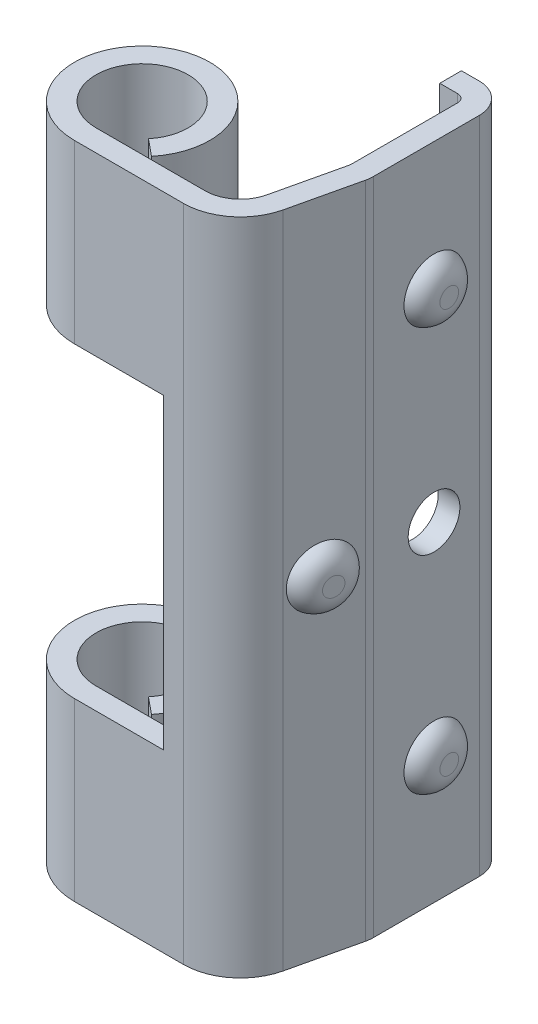
ISO-10303-21;
HEADER;
FILE_DESCRIPTION(('STEP AP214'),'2;1');
FILE_NAME('part.step','',(''),(''),'','','');
FILE_SCHEMA(('AUTOMOTIVE_DESIGN { 1 0 10303 214 1 1 1 1 }'));
ENDSEC;
DATA;
#1=APPLICATION_CONTEXT('core data for automotive mechanical design processes');
#2=APPLICATION_PROTOCOL_DEFINITION('international standard','automotive_design',2000,#1);
#3=PRODUCT_CONTEXT('',#1,'mechanical');
#4=PRODUCT('Part','Part','',(#3));
#5=PRODUCT_RELATED_PRODUCT_CATEGORY('part','',(#4));
#6=PRODUCT_DEFINITION_FORMATION('','',#4);
#7=PRODUCT_DEFINITION_CONTEXT('part definition',#1,'design');
#8=PRODUCT_DEFINITION('design','',#6,#7);
#9=PRODUCT_DEFINITION_SHAPE('','',#8);
#10=(LENGTH_UNIT() NAMED_UNIT(*) SI_UNIT(.MILLI.,.METRE.));
#11=(NAMED_UNIT(*) PLANE_ANGLE_UNIT() SI_UNIT($,.RADIAN.));
#12=(NAMED_UNIT(*) SI_UNIT($,.STERADIAN.) SOLID_ANGLE_UNIT());
#13=UNCERTAINTY_MEASURE_WITH_UNIT(LENGTH_MEASURE(1.E-05),#10,'distance_accuracy_value','');
#14=(GEOMETRIC_REPRESENTATION_CONTEXT(3) GLOBAL_UNCERTAINTY_ASSIGNED_CONTEXT((#13)) GLOBAL_UNIT_ASSIGNED_CONTEXT((#10,
#11,#12)) REPRESENTATION_CONTEXT('',''));
#15=CARTESIAN_POINT('',(0.,0.,0.));
#16=DIRECTION('',(0.,0.,1.));
#17=DIRECTION('',(1.,0.,0.));
#18=AXIS2_PLACEMENT_3D('',#15,#16,#17);
#19=CARTESIAN_POINT('',(0.251124105055345,21.9964,12.0938583782292));
#20=DIRECTION('',(-0.974370064785235,0.,-0.224951054343866));
#21=DIRECTION('',(-0.224951054343866,0.,0.974370064785235));
#22=AXIS2_PLACEMENT_3D('',#19,#20,#21);
#23=PLANE('',#22);
#24=CARTESIAN_POINT('',(0.251124105055326,21.9964,12.0938583782292));
#25=DIRECTION('',(0.974370064785235,0.,0.224951054343868));
#26=DIRECTION('',(0.224951054343868,0.,-0.974370064785235));
#27=AXIS2_PLACEMENT_3D('',#24,#25,#26);
#28=CIRCLE('',#27,0.624690596312461);
#29=CARTESIAN_POINT('',(0.391648913334514,21.9964,11.4851785614295));
#30=VERTEX_POINT('',#29);
#31=EDGE_CURVE('E20',#30,#30,#28,.F.);
#32=ORIENTED_EDGE('',*,*,#31,.F.);
#33=EDGE_LOOP('',(#32));
#34=FACE_BOUND('',#33,.T.);
#35=ADVANCED_FACE('F16',(#34),#23,.F.);
#36=CARTESIAN_POINT('',(0.870243287068091,35.4912331125158,5.0038));
#37=DIRECTION('',(-1.,0.,0.));
#38=DIRECTION('',(0.,0.,1.));
#39=AXIS2_PLACEMENT_3D('',#36,#37,#38);
#40=PLANE('',#39);
#41=CARTESIAN_POINT('',(0.870243287068091,35.4912331125158,5.0038));
#42=DIRECTION('',(1.,0.,0.));
#43=DIRECTION('',(0.,0.,-1.));
#44=AXIS2_PLACEMENT_3D('',#41,#42,#43);
#45=CIRCLE('',#44,0.624690596312479);
#46=CARTESIAN_POINT('',(0.870243287068091,35.4912331125158,4.37910940368752));
#47=VERTEX_POINT('',#46);
#48=EDGE_CURVE('E514',#47,#47,#45,.F.);
#49=ORIENTED_EDGE('',*,*,#48,.F.);
#50=EDGE_LOOP('',(#49));
#51=FACE_BOUND('',#50,.T.);
#52=ADVANCED_FACE('F524',(#51),#40,.F.);
#53=CARTESIAN_POINT('',(0.870243287068091,8.5015668874842,5.0038));
#54=DIRECTION('',(-1.,0.,0.));
#55=DIRECTION('',(0.,0.,1.));
#56=AXIS2_PLACEMENT_3D('',#53,#54,#55);
#57=PLANE('',#56);
#58=CARTESIAN_POINT('',(0.870243287068091,8.5015668874842,5.0038));
#59=DIRECTION('',(1.,0.,0.));
#60=DIRECTION('',(0.,0.,-1.));
#61=AXIS2_PLACEMENT_3D('',#58,#59,#60);
#62=CIRCLE('',#61,0.624690596312479);
#63=CARTESIAN_POINT('',(0.870243287068091,8.5015668874842,4.37910940368752));
#64=VERTEX_POINT('',#63);
#65=EDGE_CURVE('E171',#64,#64,#62,.F.);
#66=ORIENTED_EDGE('',*,*,#65,.F.);
#67=EDGE_LOOP('',(#66));
#68=FACE_BOUND('',#67,.T.);
#69=ADVANCED_FACE('F530',(#68),#57,.F.);
#70=CARTESIAN_POINT('',(-3.32075671293206,0.,0.));
#71=DIRECTION('',(1.,0.,0.));
#72=DIRECTION('',(0.,0.,-1.));
#73=AXIS2_PLACEMENT_3D('',#70,#71,#72);
#74=PLANE('',#73);
#75=DIRECTION('',(0.,1.,0.));
#76=VECTOR('',#75,1.);
#77=CARTESIAN_POINT('',(-3.32075671293206,0.,1.4478));
#78=LINE('',#77,#76);
#79=CARTESIAN_POINT('',(-3.32075671293206,43.9928,1.4478));
#80=VERTEX_POINT('',#79);
#81=CARTESIAN_POINT('',(-3.32075671293206,0.,1.4478));
#82=VERTEX_POINT('',#81);
#83=EDGE_CURVE('E439',#80,#82,#78,.F.);
#84=ORIENTED_EDGE('',*,*,#83,.F.);
#85=DIRECTION('',(0.,0.,-1.));
#86=VECTOR('',#85,1.);
#87=CARTESIAN_POINT('',(-3.32075671293206,43.9928,0.));
#88=LINE('',#87,#86);
#89=CARTESIAN_POINT('',(-3.32075671293206,43.9928,0.));
#90=VERTEX_POINT('',#89);
#91=EDGE_CURVE('E448',#90,#80,#88,.F.);
#92=ORIENTED_EDGE('',*,*,#91,.F.);
#93=DIRECTION('',(0.,1.,0.));
#94=VECTOR('',#93,1.);
#95=CARTESIAN_POINT('',(-3.32075671293206,0.,0.));
#96=LINE('',#95,#94);
#97=CARTESIAN_POINT('',(-3.32075671293206,0.,0.));
#98=VERTEX_POINT('',#97);
#99=EDGE_CURVE('E170',#90,#98,#96,.F.);
#100=ORIENTED_EDGE('',*,*,#99,.T.);
#101=DIRECTION('',(0.,0.,-1.));
#102=VECTOR('',#101,1.);
#103=CARTESIAN_POINT('',(-3.32075671293206,0.,0.));
#104=LINE('',#103,#102);
#105=EDGE_CURVE('E445',#82,#98,#104,.T.);
#106=ORIENTED_EDGE('',*,*,#105,.F.);
#107=EDGE_LOOP('',(#84,#92,#100,#106));
#108=FACE_BOUND('',#107,.T.);
#109=ADVANCED_FACE('F638',(#108),#74,.F.);
#110=CARTESIAN_POINT('',(-0.577556712931909,35.4912331125158,5.0038));
#111=DIRECTION('',(-1.,0.,0.));
#112=DIRECTION('',(0.,0.,1.));
#113=AXIS2_PLACEMENT_3D('',#110,#111,#112);
#114=PLANE('',#113);
#115=CARTESIAN_POINT('',(-0.577556712931908,35.4912331125158,5.0038));
#116=DIRECTION('',(-1.,0.,0.));
#117=DIRECTION('',(0.,0.,1.));
#118=AXIS2_PLACEMENT_3D('',#115,#116,#117);
#119=CIRCLE('',#118,0.558799999999999);
#120=CARTESIAN_POINT('',(-0.577556712931908,35.4912331125158,5.5626));
#121=VERTEX_POINT('',#120);
#122=EDGE_CURVE('E412',#121,#121,#119,.F.);
#123=ORIENTED_EDGE('',*,*,#122,.F.);
#124=EDGE_LOOP('',(#123));
#125=FACE_BOUND('',#124,.T.);
#126=ADVANCED_FACE('F779',(#125),#114,.T.);
#127=CARTESIAN_POINT('',(-0.577556712931909,8.5015668874842,5.0038));
#128=DIRECTION('',(-1.,0.,0.));
#129=DIRECTION('',(0.,0.,1.));
#130=AXIS2_PLACEMENT_3D('',#127,#128,#129);
#131=PLANE('',#130);
#132=CARTESIAN_POINT('',(-0.577556712931908,8.5015668874842,5.0038));
#133=DIRECTION('',(-1.,0.,0.));
#134=DIRECTION('',(0.,0.,1.));
#135=AXIS2_PLACEMENT_3D('',#132,#133,#134);
#136=CIRCLE('',#135,0.558799999999999);
#137=CARTESIAN_POINT('',(-0.577556712931908,8.5015668874842,5.5626));
#138=VERTEX_POINT('',#137);
#139=EDGE_CURVE('E433',#138,#138,#136,.F.);
#140=ORIENTED_EDGE('',*,*,#139,.F.);
#141=EDGE_LOOP('',(#140));
#142=FACE_BOUND('',#141,.T.);
#143=ADVANCED_FACE('F770',(#142),#131,.T.);
#144=CARTESIAN_POINT('',(-3.32075671293206,0.,1.4478));
#145=DIRECTION('',(0.,0.,1.));
#146=DIRECTION('',(1.,0.,0.));
#147=AXIS2_PLACEMENT_3D('',#144,#145,#146);
#148=PLANE('',#147);
#149=DIRECTION('',(1.,0.,0.));
#150=VECTOR('',#149,1.);
#151=CARTESIAN_POINT('',(-3.32075671293206,0.,1.4478));
#152=LINE('',#151,#150);
#153=CARTESIAN_POINT('',(-2.12695671293191,0.,1.4478));
#154=VERTEX_POINT('',#153);
#155=EDGE_CURVE('E428',#82,#154,#152,.T.);
#156=ORIENTED_EDGE('',*,*,#155,.T.);
#157=DIRECTION('',(0.,-1.,0.));
#158=VECTOR('',#157,1.);
#159=CARTESIAN_POINT('',(-2.12695671293191,0.,1.4478));
#160=LINE('',#159,#158);
#161=CARTESIAN_POINT('',(-2.12695671293191,43.9928,1.4478));
#162=VERTEX_POINT('',#161);
#163=EDGE_CURVE('E429',#154,#162,#160,.F.);
#164=ORIENTED_EDGE('',*,*,#163,.T.);
#165=DIRECTION('',(1.,0.,0.));
#166=VECTOR('',#165,1.);
#167=CARTESIAN_POINT('',(-3.32075671293206,43.9928,1.4478));
#168=LINE('',#167,#166);
#169=EDGE_CURVE('E442',#162,#80,#168,.F.);
#170=ORIENTED_EDGE('',*,*,#169,.T.);
#171=ORIENTED_EDGE('',*,*,#83,.T.);
#172=EDGE_LOOP('',(#156,#164,#170,#171));
#173=FACE_BOUND('',#172,.T.);
#174=ADVANCED_FACE('F631',(#173),#148,.T.);
#175=CARTESIAN_POINT('',(-1.15956887474072,21.9964,11.7681742417502));
#176=DIRECTION('',(-0.974370064785235,0.,-0.224951054343866));
#177=DIRECTION('',(-0.224951054343866,0.,0.974370064785235));
#178=AXIS2_PLACEMENT_3D('',#175,#176,#177);
#179=PLANE('',#178);
#180=CARTESIAN_POINT('',(-1.1595688747407,21.9964,11.7681742417501));
#181=DIRECTION('',(-0.974370064785235,0.,-0.224951054343866));
#182=DIRECTION('',(-0.224951054343866,0.,0.974370064785235));
#183=AXIS2_PLACEMENT_3D('',#180,#181,#182);
#184=CIRCLE('',#183,0.558799999999994);
#185=CARTESIAN_POINT('',(-1.28527152390805,21.9964,12.3126522339521));
#186=VERTEX_POINT('',#185);
#187=EDGE_CURVE('E505',#186,#186,#184,.F.);
#188=ORIENTED_EDGE('',*,*,#187,.F.);
#189=EDGE_LOOP('',(#188));
#190=FACE_BOUND('',#189,.T.);
#191=ADVANCED_FACE('F670',(#190),#179,.T.);
#192=CARTESIAN_POINT('',(-8.71744862460074,21.9964,15.2908));
#193=DIRECTION('',(0.634831460674158,0.,-0.772650643265322));
#194=DIRECTION('',(-0.772650643265322,0.,-0.634831460674158));
#195=AXIS2_PLACEMENT_3D('',#192,#193,#194);
#196=PLANE('',#195);
#197=DIRECTION('',(0.,-1.,0.));
#198=VECTOR('',#197,1.);
#199=CARTESIAN_POINT('',(-9.83609222592024,0.,14.3716910112359));
#200=LINE('',#199,#198);
#201=CARTESIAN_POINT('',(-9.83609222592025,11.7348,14.3716910112359));
#202=VERTEX_POINT('',#201);
#203=CARTESIAN_POINT('',(-9.83609222592024,0.,14.3716910112359));
#204=VERTEX_POINT('',#203);
#205=EDGE_CURVE('E329',#202,#204,#200,.T.);
#206=ORIENTED_EDGE('',*,*,#205,.T.);
#207=DIRECTION('',(-0.772650643265302,0.,-0.634831460674182));
#208=VECTOR('',#207,1.);
#209=CARTESIAN_POINT('',(-8.71744862460074,0.,15.2908));
#210=LINE('',#209,#208);
#211=CARTESIAN_POINT('',(-8.71744862460073,0.,15.2908));
#212=VERTEX_POINT('',#211);
#213=EDGE_CURVE('E322',#212,#204,#210,.T.);
#214=ORIENTED_EDGE('',*,*,#213,.F.);
#215=DIRECTION('',(0.,-1.,0.));
#216=VECTOR('',#215,1.);
#217=CARTESIAN_POINT('',(-8.71744862460073,0.,15.2908));
#218=LINE('',#217,#216);
#219=CARTESIAN_POINT('',(-8.71744862460073,11.7348,15.2908));
#220=VERTEX_POINT('',#219);
#221=EDGE_CURVE('E419',#220,#212,#218,.T.);
#222=ORIENTED_EDGE('',*,*,#221,.F.);
#223=DIRECTION('',(-0.772650643265322,0.,-0.634831460674158));
#224=VECTOR('',#223,1.);
#225=CARTESIAN_POINT('',(-8.71744862460074,11.7348,15.2908));
#226=LINE('',#225,#224);
#227=EDGE_CURVE('E426',#202,#220,#226,.F.);
#228=ORIENTED_EDGE('',*,*,#227,.F.);
#229=EDGE_LOOP('',(#206,#214,#222,#228));
#230=FACE_BOUND('',#229,.T.);
#231=ADVANCED_FACE('F606',(#230),#196,.F.);
#232=CARTESIAN_POINT('',(-1.15956887474075,21.9964,11.7681742417501));
#233=DIRECTION('',(0.974370064785235,0.,0.224951054343868));
#234=DIRECTION('',(0.224951054343868,0.,-0.974370064785235));
#235=AXIS2_PLACEMENT_3D('',#232,#233,#234);
#236=DEGENERATE_TOROIDAL_SURFACE('',#235,0.624690596312477,1.44780000000002,.T.);
#237=CARTESIAN_POINT('',(-0.73883588076645,21.9964,11.8653081070158));
#238=DIRECTION('',(0.974370064785235,0.,0.224951054343868));
#239=DIRECTION('',(0.224951054343868,0.,-0.974370064785235));
#240=AXIS2_PLACEMENT_3D('',#237,#238,#239);
#241=CIRCLE('',#240,2.0066);
#242=CARTESIAN_POINT('',(-0.287449095120044,21.9964,9.91013713501778));
#243=VERTEX_POINT('',#242);
#244=EDGE_CURVE('E182',#243,#243,#241,.T.);
#245=ORIENTED_EDGE('',*,*,#244,.T.);
#246=EDGE_LOOP('',(#245));
#247=FACE_BOUND('',#246,.T.);
#248=ORIENTED_EDGE('',*,*,#31,.T.);
#249=EDGE_LOOP('',(#248));
#250=FACE_BOUND('',#249,.T.);
#251=ADVANCED_FACE('F521',(#247,#250),#236,.T.);
#252=CARTESIAN_POINT('',(-0.577556712931908,35.4912331125158,5.0038));
#253=DIRECTION('',(1.,0.,0.));
#254=DIRECTION('',(0.,0.,-1.));
#255=AXIS2_PLACEMENT_3D('',#252,#253,#254);
#256=DEGENERATE_TOROIDAL_SURFACE('',#255,0.624690596312479,1.4478,.T.);
#257=CARTESIAN_POINT('',(-0.145756712931909,35.4912331125158,5.0038));
#258=DIRECTION('',(1.,0.,0.));
#259=DIRECTION('',(0.,0.,-1.));
#260=AXIS2_PLACEMENT_3D('',#257,#258,#259);
#261=CIRCLE('',#260,2.0066);
#262=CARTESIAN_POINT('',(-0.145756712931909,35.4912331125158,2.9972));
#263=VERTEX_POINT('',#262);
#264=EDGE_CURVE('E294',#263,#263,#261,.T.);
#265=ORIENTED_EDGE('',*,*,#264,.T.);
#266=EDGE_LOOP('',(#265));
#267=FACE_BOUND('',#266,.T.);
#268=ORIENTED_EDGE('',*,*,#48,.T.);
#269=EDGE_LOOP('',(#268));
#270=FACE_BOUND('',#269,.T.);
#271=ADVANCED_FACE('F659',(#267,#270),#256,.T.);
#272=CARTESIAN_POINT('',(-0.577556712931908,8.5015668874842,5.0038));
#273=DIRECTION('',(1.,0.,0.));
#274=DIRECTION('',(0.,0.,-1.));
#275=AXIS2_PLACEMENT_3D('',#272,#273,#274);
#276=DEGENERATE_TOROIDAL_SURFACE('',#275,0.624690596312479,1.4478,.T.);
#277=CARTESIAN_POINT('',(-0.145756712931909,8.5015668874842,5.0038));
#278=DIRECTION('',(1.,0.,0.));
#279=DIRECTION('',(0.,0.,-1.));
#280=AXIS2_PLACEMENT_3D('',#277,#278,#279);
#281=CIRCLE('',#280,2.0066);
#282=CARTESIAN_POINT('',(-0.145756712931909,8.5015668874842,2.9972));
#283=VERTEX_POINT('',#282);
#284=EDGE_CURVE('E482',#283,#283,#281,.T.);
#285=ORIENTED_EDGE('',*,*,#284,.T.);
#286=EDGE_LOOP('',(#285));
#287=FACE_BOUND('',#286,.T.);
#288=ORIENTED_EDGE('',*,*,#65,.T.);
#289=EDGE_LOOP('',(#288));
#290=FACE_BOUND('',#289,.T.);
#291=ADVANCED_FACE('F18',(#287,#290),#276,.T.);
#292=CARTESIAN_POINT('',(-2.33015671293191,0.,9.04751905722588));
#293=DIRECTION('',(0.,-1.,0.));
#294=DIRECTION('',(0.,0.,-1.));
#295=AXIS2_PLACEMENT_3D('',#292,#293,#294);
#296=CYLINDRICAL_SURFACE('',#295,2.1844);
#297=CARTESIAN_POINT('',(-2.33015671293191,0.,9.04751905722588));
#298=DIRECTION('',(0.,-1.,0.));
#299=DIRECTION('',(0.,0.,-1.));
#300=AXIS2_PLACEMENT_3D('',#297,#298,#299);
#301=CIRCLE('',#300,2.1844);
#302=CARTESIAN_POINT('',(-0.145756712931909,0.,9.04751905722588));
#303=VERTEX_POINT('',#302);
#304=CARTESIAN_POINT('',(-0.201742743415041,0.,9.53890214033462));
#305=VERTEX_POINT('',#304);
#306=EDGE_CURVE('E326',#303,#305,#301,.T.);
#307=ORIENTED_EDGE('',*,*,#306,.F.);
#308=DIRECTION('',(0.,1.,0.));
#309=VECTOR('',#308,1.);
#310=CARTESIAN_POINT('',(-0.145756712931909,0.,9.04751905722588));
#311=LINE('',#310,#309);
#312=CARTESIAN_POINT('',(-0.145756712931909,43.9928,9.04751905722588));
#313=VERTEX_POINT('',#312);
#314=EDGE_CURVE('E168',#303,#313,#311,.T.);
#315=ORIENTED_EDGE('',*,*,#314,.T.);
#316=CARTESIAN_POINT('',(-2.33015671293191,43.9928,9.04751905722588));
#317=DIRECTION('',(0.,-1.,0.));
#318=DIRECTION('',(0.,0.,-1.));
#319=AXIS2_PLACEMENT_3D('',#316,#317,#318);
#320=CIRCLE('',#319,2.1844);
#321=CARTESIAN_POINT('',(-0.201742743415042,43.9928,9.53890214033462));
#322=VERTEX_POINT('',#321);
#323=EDGE_CURVE('E160',#313,#322,#320,.T.);
#324=ORIENTED_EDGE('',*,*,#323,.T.);
#325=DIRECTION('',(0.,1.,0.));
#326=VECTOR('',#325,1.);
#327=CARTESIAN_POINT('',(-0.201742743415041,0.,9.53890214033462));
#328=LINE('',#327,#326);
#329=EDGE_CURVE('E165',#322,#305,#328,.F.);
#330=ORIENTED_EDGE('',*,*,#329,.T.);
#331=EDGE_LOOP('',(#307,#315,#324,#330));
#332=FACE_BOUND('',#331,.T.);
#333=ADVANCED_FACE('F164',(#332),#296,.T.);
#334=CARTESIAN_POINT('',(-3.32075671293206,0.,0.));
#335=DIRECTION('',(0.,0.,1.));
#336=DIRECTION('',(1.,0.,0.));
#337=AXIS2_PLACEMENT_3D('',#334,#335,#336);
#338=PLANE('',#337);
#339=DIRECTION('',(0.,-1.,0.));
#340=VECTOR('',#339,1.);
#341=CARTESIAN_POINT('',(-2.12695671293191,0.,0.));
#342=LINE('',#341,#340);
#343=CARTESIAN_POINT('',(-2.12695671293191,0.,0.));
#344=VERTEX_POINT('',#343);
#345=CARTESIAN_POINT('',(-2.12695671293191,43.9928,0.));
#346=VERTEX_POINT('',#345);
#347=EDGE_CURVE('E283',#344,#346,#342,.F.);
#348=ORIENTED_EDGE('',*,*,#347,.F.);
#349=DIRECTION('',(1.,0.,0.));
#350=VECTOR('',#349,1.);
#351=CARTESIAN_POINT('',(-3.32075671293206,0.,0.));
#352=LINE('',#351,#350);
#353=EDGE_CURVE('E327',#98,#344,#352,.T.);
#354=ORIENTED_EDGE('',*,*,#353,.F.);
#355=ORIENTED_EDGE('',*,*,#99,.F.);
#356=DIRECTION('',(1.,0.,0.));
#357=VECTOR('',#356,1.);
#358=CARTESIAN_POINT('',(-3.32075671293206,43.9928,0.));
#359=LINE('',#358,#357);
#360=EDGE_CURVE('E404',#346,#90,#359,.F.);
#361=ORIENTED_EDGE('',*,*,#360,.F.);
#362=EDGE_LOOP('',(#348,#354,#355,#361));
#363=FACE_BOUND('',#362,.T.);
#364=ADVANCED_FACE('F646',(#363),#338,.F.);
#365=CARTESIAN_POINT('',(-0.145756712931909,35.4912331125158,5.0038));
#366=DIRECTION('',(-1.,0.,0.));
#367=DIRECTION('',(0.,0.,1.));
#368=AXIS2_PLACEMENT_3D('',#365,#366,#367);
#369=TOROIDAL_SURFACE('',#368,1.94070940368752,1.4478);
#370=ORIENTED_EDGE('',*,*,#122,.T.);
#371=EDGE_LOOP('',(#370));
#372=FACE_BOUND('',#371,.T.);
#373=CARTESIAN_POINT('',(-1.59355671293191,35.4912331125158,5.0038));
#374=DIRECTION('',(-1.,0.,0.));
#375=DIRECTION('',(0.,0.,1.));
#376=AXIS2_PLACEMENT_3D('',#373,#374,#375);
#377=CIRCLE('',#376,1.94070940368752);
#378=CARTESIAN_POINT('',(-1.59355671293191,35.4912331125158,6.94450940368752));
#379=VERTEX_POINT('',#378);
#380=EDGE_CURVE('E286',#379,#379,#377,.F.);
#381=ORIENTED_EDGE('',*,*,#380,.F.);
#382=EDGE_LOOP('',(#381));
#383=FACE_BOUND('',#382,.T.);
#384=ADVANCED_FACE('F383',(#372,#383),#369,.T.);
#385=CARTESIAN_POINT('',(-0.145756712931909,8.5015668874842,5.0038));
#386=DIRECTION('',(-1.,0.,0.));
#387=DIRECTION('',(0.,0.,1.));
#388=AXIS2_PLACEMENT_3D('',#385,#386,#387);
#389=TOROIDAL_SURFACE('',#388,1.94070940368752,1.4478);
#390=ORIENTED_EDGE('',*,*,#139,.T.);
#391=EDGE_LOOP('',(#390));
#392=FACE_BOUND('',#391,.T.);
#393=CARTESIAN_POINT('',(-1.59355671293191,8.5015668874842,5.0038));
#394=DIRECTION('',(-1.,0.,0.));
#395=DIRECTION('',(0.,0.,1.));
#396=AXIS2_PLACEMENT_3D('',#393,#394,#395);
#397=CIRCLE('',#396,1.94070940368752);
#398=CARTESIAN_POINT('',(-1.59355671293191,8.5015668874842,6.94450940368752));
#399=VERTEX_POINT('',#398);
#400=EDGE_CURVE('E477',#399,#399,#397,.F.);
#401=ORIENTED_EDGE('',*,*,#400,.F.);
#402=EDGE_LOOP('',(#401));
#403=FACE_BOUND('',#402,.T.);
#404=ADVANCED_FACE('F378',(#392,#403),#389,.T.);
#405=CARTESIAN_POINT('',(-50.1207419075645,21.9964,5.0038));
#406=DIRECTION('',(-1.,0.,0.));
#407=DIRECTION('',(0.,0.,1.));
#408=AXIS2_PLACEMENT_3D('',#405,#406,#407);
#409=CYLINDRICAL_SURFACE('',#408,1.7272);
#410=CARTESIAN_POINT('',(-1.59355671293191,21.9964,5.0038));
#411=DIRECTION('',(-1.,0.,0.));
#412=DIRECTION('',(0.,0.,1.));
#413=AXIS2_PLACEMENT_3D('',#410,#411,#412);
#414=CIRCLE('',#413,1.7272);
#415=CARTESIAN_POINT('',(-1.59355671293191,21.9964,6.731));
#416=VERTEX_POINT('',#415);
#417=EDGE_CURVE('E279',#416,#416,#414,.F.);
#418=ORIENTED_EDGE('',*,*,#417,.F.);
#419=EDGE_LOOP('',(#418));
#420=FACE_BOUND('',#419,.T.);
#421=CARTESIAN_POINT('',(-0.145756712931912,21.9964,5.0038));
#422=DIRECTION('',(-1.,0.,0.));
#423=DIRECTION('',(0.,0.,1.));
#424=AXIS2_PLACEMENT_3D('',#421,#422,#423);
#425=CIRCLE('',#424,1.7272);
#426=CARTESIAN_POINT('',(-0.145756712931912,21.9964,6.731));
#427=VERTEX_POINT('',#426);
#428=EDGE_CURVE('E417',#427,#427,#425,.F.);
#429=ORIENTED_EDGE('',*,*,#428,.T.);
#430=EDGE_LOOP('',(#429));
#431=FACE_BOUND('',#430,.T.);
#432=ADVANCED_FACE('F382',(#420,#431),#409,.F.);
#433=CARTESIAN_POINT('',(-2.12695671293191,0.,1.9812));
#434=DIRECTION('',(0.,-1.,0.));
#435=DIRECTION('',(0.,0.,-1.));
#436=AXIS2_PLACEMENT_3D('',#433,#434,#435);
#437=CYLINDRICAL_SURFACE('',#436,0.5334);
#438=ORIENTED_EDGE('',*,*,#163,.F.);
#439=CARTESIAN_POINT('',(-2.12695671293191,0.,1.9812));
#440=DIRECTION('',(0.,-1.,0.));
#441=DIRECTION('',(0.,0.,-1.));
#442=AXIS2_PLACEMENT_3D('',#439,#440,#441);
#443=CIRCLE('',#442,0.5334);
#444=CARTESIAN_POINT('',(-1.59355671293191,0.,1.9812));
#445=VERTEX_POINT('',#444);
#446=EDGE_CURVE('E423',#445,#154,#443,.F.);
#447=ORIENTED_EDGE('',*,*,#446,.F.);
#448=DIRECTION('',(0.,1.,0.));
#449=VECTOR('',#448,1.);
#450=CARTESIAN_POINT('',(-1.59355671293191,0.,1.9812));
#451=LINE('',#450,#449);
#452=CARTESIAN_POINT('',(-1.59355671293191,43.9928,1.9812));
#453=VERTEX_POINT('',#452);
#454=EDGE_CURVE('E270',#453,#445,#451,.F.);
#455=ORIENTED_EDGE('',*,*,#454,.F.);
#456=CARTESIAN_POINT('',(-2.12695671293191,43.9928,1.9812));
#457=DIRECTION('',(0.,-1.,0.));
#458=DIRECTION('',(0.,0.,-1.));
#459=AXIS2_PLACEMENT_3D('',#456,#457,#458);
#460=CIRCLE('',#459,0.5334);
#461=EDGE_CURVE('E432',#162,#453,#460,.T.);
#462=ORIENTED_EDGE('',*,*,#461,.F.);
#463=EDGE_LOOP('',(#438,#447,#455,#462));
#464=FACE_BOUND('',#463,.T.);
#465=ADVANCED_FACE('F359',(#464),#437,.F.);
#466=CARTESIAN_POINT('',(-0.738835880766454,21.9964,11.8653081070158));
#467=DIRECTION('',(-0.974370064785235,0.,-0.224951054343866));
#468=DIRECTION('',(-0.224951054343866,0.,0.974370064785235));
#469=AXIS2_PLACEMENT_3D('',#466,#467,#468);
#470=TOROIDAL_SURFACE('',#469,1.94070940368752,1.4478);
#471=ORIENTED_EDGE('',*,*,#187,.T.);
#472=EDGE_LOOP('',(#471));
#473=FACE_BOUND('',#472,.T.);
#474=CARTESIAN_POINT('',(-2.14952886056252,21.9964,11.5396239705368));
#475=DIRECTION('',(-0.974370064785235,0.,-0.224951054343866));
#476=DIRECTION('',(-0.224951054343866,0.,0.974370064785235));
#477=AXIS2_PLACEMENT_3D('',#474,#475,#476);
#478=CIRCLE('',#477,1.94070940368755);
#479=CARTESIAN_POINT('',(-2.58609348709709,21.9964,13.4305931179371));
#480=VERTEX_POINT('',#479);
#481=EDGE_CURVE('E233',#480,#480,#478,.F.);
#482=ORIENTED_EDGE('',*,*,#481,.F.);
#483=EDGE_LOOP('',(#482));
#484=FACE_BOUND('',#483,.T.);
#485=ADVANCED_FACE('F353',(#473,#484),#470,.T.);
#486=CARTESIAN_POINT('',(-2.33015671293191,0.,9.04751905722588));
#487=DIRECTION('',(0.,-1.,0.));
#488=DIRECTION('',(0.,0.,-1.));
#489=AXIS2_PLACEMENT_3D('',#486,#487,#488);
#490=CYLINDRICAL_SURFACE('',#489,0.7366);
#491=DIRECTION('',(0.,1.,0.));
#492=VECTOR('',#491,1.);
#493=CARTESIAN_POINT('',(-1.59355671293191,0.,9.04751905722588));
#494=LINE('',#493,#492);
#495=CARTESIAN_POINT('',(-1.59355671293191,0.,9.04751905722588));
#496=VERTEX_POINT('',#495);
#497=CARTESIAN_POINT('',(-1.59355671293191,43.9928,9.04751905722588));
#498=VERTEX_POINT('',#497);
#499=EDGE_CURVE('E280',#496,#498,#494,.T.);
#500=ORIENTED_EDGE('',*,*,#499,.F.);
#501=CARTESIAN_POINT('',(-2.33015671293191,0.,9.04751905722588));
#502=DIRECTION('',(0.,-1.,0.));
#503=DIRECTION('',(0.,0.,-1.));
#504=AXIS2_PLACEMENT_3D('',#501,#502,#503);
#505=CIRCLE('',#504,0.7366);
#506=CARTESIAN_POINT('',(-1.61243572321111,0.,9.21321800385557));
#507=VERTEX_POINT('',#506);
#508=EDGE_CURVE('E500',#507,#496,#505,.F.);
#509=ORIENTED_EDGE('',*,*,#508,.F.);
#510=DIRECTION('',(0.,1.,0.));
#511=VECTOR('',#510,1.);
#512=CARTESIAN_POINT('',(-1.61243572321111,0.,9.21321800385558));
#513=LINE('',#512,#511);
#514=CARTESIAN_POINT('',(-1.61243572321111,43.9928,9.21321800385557));
#515=VERTEX_POINT('',#514);
#516=EDGE_CURVE('E238',#515,#507,#513,.F.);
#517=ORIENTED_EDGE('',*,*,#516,.F.);
#518=CARTESIAN_POINT('',(-2.33015671293191,43.9928,9.04751905722588));
#519=DIRECTION('',(0.,-1.,0.));
#520=DIRECTION('',(0.,0.,-1.));
#521=AXIS2_PLACEMENT_3D('',#518,#519,#520);
#522=CIRCLE('',#521,0.7366);
#523=EDGE_CURVE('E425',#498,#515,#522,.T.);
#524=ORIENTED_EDGE('',*,*,#523,.F.);
#525=EDGE_LOOP('',(#500,#509,#517,#524));
#526=FACE_BOUND('',#525,.T.);
#527=ADVANCED_FACE('F358',(#526),#490,.F.);
#528=CARTESIAN_POINT('',(-12.2107567129319,0.,12.4206));
#529=DIRECTION('',(0.,-1.,0.));
#530=DIRECTION('',(0.,0.,-1.));
#531=AXIS2_PLACEMENT_3D('',#528,#529,#530);
#532=CYLINDRICAL_SURFACE('',#531,3.0734);
#533=DIRECTION('',(0.,1.,0.));
#534=VECTOR('',#533,1.);
#535=CARTESIAN_POINT('',(-12.2107567129319,0.,15.494));
#536=LINE('',#535,#534);
#537=CARTESIAN_POINT('',(-12.2107567129319,0.,15.494));
#538=VERTEX_POINT('',#537);
#539=CARTESIAN_POINT('',(-12.2107567129319,11.7348,15.494));
#540=VERTEX_POINT('',#539);
#541=EDGE_CURVE('E339',#538,#540,#536,.T.);
#542=ORIENTED_EDGE('',*,*,#541,.F.);
#543=CARTESIAN_POINT('',(-12.2107567129319,0.,12.4206));
#544=DIRECTION('',(0.,-1.,0.));
#545=DIRECTION('',(0.,0.,-1.));
#546=AXIS2_PLACEMENT_3D('',#543,#544,#545);
#547=CIRCLE('',#546,3.0734);
#548=EDGE_CURVE('E325',#204,#538,#547,.F.);
#549=ORIENTED_EDGE('',*,*,#548,.F.);
#550=ORIENTED_EDGE('',*,*,#205,.F.);
#551=CARTESIAN_POINT('',(-12.2107567129319,11.7348,12.4206));
#552=DIRECTION('',(0.,-1.,0.));
#553=DIRECTION('',(0.,0.,-1.));
#554=AXIS2_PLACEMENT_3D('',#551,#552,#553);
#555=CIRCLE('',#554,3.0734);
#556=EDGE_CURVE('E493',#540,#202,#555,.T.);
#557=ORIENTED_EDGE('',*,*,#556,.F.);
#558=EDGE_LOOP('',(#542,#549,#550,#557));
#559=FACE_BOUND('',#558,.T.);
#560=ADVANCED_FACE('F604',(#559),#532,.F.);
#561=CARTESIAN_POINT('',(-3.32075671293206,0.,0.));
#562=DIRECTION('',(0.,-1.,0.));
#563=DIRECTION('',(0.,0.,-1.));
#564=AXIS2_PLACEMENT_3D('',#561,#562,#563);
#565=PLANE('',#564);
#566=ORIENTED_EDGE('',*,*,#155,.F.);
#567=ORIENTED_EDGE('',*,*,#105,.T.);
#568=ORIENTED_EDGE('',*,*,#353,.T.);
#569=CARTESIAN_POINT('',(-2.12695671293191,0.,1.9812));
#570=DIRECTION('',(0.,-1.,0.));
#571=DIRECTION('',(0.,0.,-1.));
#572=AXIS2_PLACEMENT_3D('',#569,#570,#571);
#573=CIRCLE('',#572,1.9812);
#574=CARTESIAN_POINT('',(-0.145756712931909,0.,1.9812));
#575=VERTEX_POINT('',#574);
#576=EDGE_CURVE('E287',#575,#344,#573,.F.);
#577=ORIENTED_EDGE('',*,*,#576,.F.);
#578=DIRECTION('',(0.,0.,1.));
#579=VECTOR('',#578,1.);
#580=CARTESIAN_POINT('',(-0.145756712931909,0.,1.9812));
#581=LINE('',#580,#579);
#582=EDGE_CURVE('E292',#575,#303,#581,.T.);
#583=ORIENTED_EDGE('',*,*,#582,.T.);
#584=ORIENTED_EDGE('',*,*,#306,.T.);
#585=DIRECTION('',(-0.224951054343866,0.,0.974370064785235));
#586=VECTOR('',#585,1.);
#587=CARTESIAN_POINT('',(-0.145756712931909,0.,9.2964));
#588=LINE('',#587,#586);
#589=CARTESIAN_POINT('',(-1.22909727703597,0.,13.9888635170501));
#590=VERTEX_POINT('',#589);
#591=EDGE_CURVE('E181',#305,#590,#588,.T.);
#592=ORIENTED_EDGE('',*,*,#591,.T.);
#593=CARTESIAN_POINT('',(-4.94144722386772,0.,13.1318));
#594=DIRECTION('',(0.,-1.,0.));
#595=DIRECTION('',(0.,0.,-1.));
#596=AXIS2_PLACEMENT_3D('',#593,#594,#595);
#597=CIRCLE('',#596,3.81);
#598=CARTESIAN_POINT('',(-4.94144722386772,0.,16.9418));
#599=VERTEX_POINT('',#598);
#600=EDGE_CURVE('E311',#599,#590,#597,.F.);
#601=ORIENTED_EDGE('',*,*,#600,.F.);
#602=DIRECTION('',(-1.,0.,0.));
#603=VECTOR('',#602,1.);
#604=CARTESIAN_POINT('',(-4.94144722386772,0.,16.9418));
#605=LINE('',#604,#603);
#606=CARTESIAN_POINT('',(-12.2107567129319,0.,16.9418));
#607=VERTEX_POINT('',#606);
#608=EDGE_CURVE('E298',#599,#607,#605,.T.);
#609=ORIENTED_EDGE('',*,*,#608,.T.);
#610=CARTESIAN_POINT('',(-12.2107567129319,0.,12.4206));
#611=DIRECTION('',(0.,-1.,0.));
#612=DIRECTION('',(0.,0.,-1.));
#613=AXIS2_PLACEMENT_3D('',#610,#611,#612);
#614=CIRCLE('',#613,4.5212);
#615=EDGE_CURVE('E422',#212,#607,#614,.F.);
#616=ORIENTED_EDGE('',*,*,#615,.F.);
#617=ORIENTED_EDGE('',*,*,#213,.T.);
#618=ORIENTED_EDGE('',*,*,#548,.T.);
#619=DIRECTION('',(-1.,0.,0.));
#620=VECTOR('',#619,1.);
#621=CARTESIAN_POINT('',(-4.94144722386772,0.,15.494));
#622=LINE('',#621,#620);
#623=CARTESIAN_POINT('',(-4.94144722386772,0.,15.494));
#624=VERTEX_POINT('',#623);
#625=EDGE_CURVE('E225',#624,#538,#622,.T.);
#626=ORIENTED_EDGE('',*,*,#625,.F.);
#627=CARTESIAN_POINT('',(-4.94144722386772,0.,13.1318));
#628=DIRECTION('',(0.,-1.,0.));
#629=DIRECTION('',(0.,0.,-1.));
#630=AXIS2_PLACEMENT_3D('',#627,#628,#629);
#631=CIRCLE('',#630,2.3622);
#632=CARTESIAN_POINT('',(-2.63979025683204,0.,13.6631793805711));
#633=VERTEX_POINT('',#632);
#634=EDGE_CURVE('E228',#624,#633,#631,.F.);
#635=ORIENTED_EDGE('',*,*,#634,.T.);
#636=DIRECTION('',(-0.224951054343866,0.,0.974370064785235));
#637=VECTOR('',#636,1.);
#638=CARTESIAN_POINT('',(-1.55644969272798,0.,8.97071586352095));
#639=LINE('',#638,#637);
#640=EDGE_CURVE('E346',#507,#633,#639,.T.);
#641=ORIENTED_EDGE('',*,*,#640,.F.);
#642=ORIENTED_EDGE('',*,*,#508,.T.);
#643=DIRECTION('',(0.,0.,1.));
#644=VECTOR('',#643,1.);
#645=CARTESIAN_POINT('',(-1.59355671293191,0.,1.9812));
#646=LINE('',#645,#644);
#647=EDGE_CURVE('E278',#445,#496,#646,.T.);
#648=ORIENTED_EDGE('',*,*,#647,.F.);
#649=ORIENTED_EDGE('',*,*,#446,.T.);
#650=EDGE_LOOP('',(#566,#567,#568,#577,#583,#584,#592,#601,#609,#616,#617,#618,#626,#635,#641,
#642,#648,#649));
#651=FACE_BOUND('',#650,.T.);
#652=ADVANCED_FACE('F599',(#651),#565,.T.);
#653=CARTESIAN_POINT('',(-12.2107567129319,0.,12.4206));
#654=DIRECTION('',(0.,-1.,0.));
#655=DIRECTION('',(0.,0.,-1.));
#656=AXIS2_PLACEMENT_3D('',#653,#654,#655);
#657=CYLINDRICAL_SURFACE('',#656,4.5212);
#658=ORIENTED_EDGE('',*,*,#221,.T.);
#659=ORIENTED_EDGE('',*,*,#615,.T.);
#660=DIRECTION('',(0.,1.,0.));
#661=VECTOR('',#660,1.);
#662=CARTESIAN_POINT('',(-12.2107567129319,0.,16.9418));
#663=LINE('',#662,#661);
#664=CARTESIAN_POINT('',(-12.2107567129319,11.7348,16.9418));
#665=VERTEX_POINT('',#664);
#666=EDGE_CURVE('E317',#607,#665,#663,.T.);
#667=ORIENTED_EDGE('',*,*,#666,.T.);
#668=CARTESIAN_POINT('',(-12.2107567129319,11.7348,12.4206));
#669=DIRECTION('',(0.,-1.,0.));
#670=DIRECTION('',(0.,0.,-1.));
#671=AXIS2_PLACEMENT_3D('',#668,#669,#670);
#672=CIRCLE('',#671,4.5212);
#673=EDGE_CURVE('E312',#220,#665,#672,.F.);
#674=ORIENTED_EDGE('',*,*,#673,.F.);
#675=EDGE_LOOP('',(#658,#659,#667,#674));
#676=FACE_BOUND('',#675,.T.);
#677=ADVANCED_FACE('F612',(#676),#657,.T.);
#678=CARTESIAN_POINT('',(-4.94144722386772,11.7348,16.9418));
#679=DIRECTION('',(0.,1.,0.));
#680=DIRECTION('',(0.,0.,1.));
#681=AXIS2_PLACEMENT_3D('',#678,#679,#680);
#682=PLANE('',#681);
#683=DIRECTION('',(-1.,0.,0.));
#684=VECTOR('',#683,1.);
#685=CARTESIAN_POINT('',(-4.94144722386772,11.7348,16.9418));
#686=LINE('',#685,#684);
#687=CARTESIAN_POINT('',(-6.2671567129319,11.7348,16.9418));
#688=VERTEX_POINT('',#687);
#689=EDGE_CURVE('E305',#665,#688,#686,.F.);
#690=ORIENTED_EDGE('',*,*,#689,.T.);
#691=DIRECTION('',(0.,0.,1.));
#692=VECTOR('',#691,1.);
#693=CARTESIAN_POINT('',(-6.2671567129319,11.7348,16.9418));
#694=LINE('',#693,#692);
#695=CARTESIAN_POINT('',(-6.2671567129319,11.7348,15.494));
#696=VERTEX_POINT('',#695);
#697=EDGE_CURVE('E308',#696,#688,#694,.T.);
#698=ORIENTED_EDGE('',*,*,#697,.F.);
#699=DIRECTION('',(-1.,0.,0.));
#700=VECTOR('',#699,1.);
#701=CARTESIAN_POINT('',(-4.94144722386772,11.7348,15.494));
#702=LINE('',#701,#700);
#703=EDGE_CURVE('E334',#540,#696,#702,.F.);
#704=ORIENTED_EDGE('',*,*,#703,.F.);
#705=ORIENTED_EDGE('',*,*,#556,.T.);
#706=ORIENTED_EDGE('',*,*,#227,.T.);
#707=ORIENTED_EDGE('',*,*,#673,.T.);
#708=EDGE_LOOP('',(#690,#698,#704,#705,#706,#707));
#709=FACE_BOUND('',#708,.T.);
#710=ADVANCED_FACE('F571',(#709),#682,.T.);
#711=CARTESIAN_POINT('',(-6.2671567129319,0.,16.9418));
#712=DIRECTION('',(-1.,0.,0.));
#713=DIRECTION('',(0.,-1.,0.));
#714=AXIS2_PLACEMENT_3D('',#711,#712,#713);
#715=PLANE('',#714);
#716=DIRECTION('',(0.,0.,1.));
#717=VECTOR('',#716,1.);
#718=CARTESIAN_POINT('',(-6.2671567129319,32.2326,12.4206));
#719=LINE('',#718,#717);
#720=CARTESIAN_POINT('',(-6.2671567129319,32.2326,16.9418));
#721=VERTEX_POINT('',#720);
#722=CARTESIAN_POINT('',(-6.2671567129319,32.2326,15.494));
#723=VERTEX_POINT('',#722);
#724=EDGE_CURVE('E214',#721,#723,#719,.F.);
#725=ORIENTED_EDGE('',*,*,#724,.T.);
#726=DIRECTION('',(0.,1.,0.));
#727=VECTOR('',#726,1.);
#728=CARTESIAN_POINT('',(-6.2671567129319,0.,15.494));
#729=LINE('',#728,#727);
#730=EDGE_CURVE('E221',#696,#723,#729,.T.);
#731=ORIENTED_EDGE('',*,*,#730,.F.);
#732=ORIENTED_EDGE('',*,*,#697,.T.);
#733=DIRECTION('',(0.,1.,0.));
#734=VECTOR('',#733,1.);
#735=CARTESIAN_POINT('',(-6.2671567129319,0.,16.9418));
#736=LINE('',#735,#734);
#737=EDGE_CURVE('E205',#688,#721,#736,.T.);
#738=ORIENTED_EDGE('',*,*,#737,.T.);
#739=EDGE_LOOP('',(#725,#731,#732,#738));
#740=FACE_BOUND('',#739,.T.);
#741=ADVANCED_FACE('F575',(#740),#715,.T.);
#742=CARTESIAN_POINT('',(-4.94144722386772,0.,13.1318));
#743=DIRECTION('',(0.,-1.,0.));
#744=DIRECTION('',(0.,0.,-1.));
#745=AXIS2_PLACEMENT_3D('',#742,#743,#744);
#746=CYLINDRICAL_SURFACE('',#745,3.81);
#747=ORIENTED_EDGE('',*,*,#600,.T.);
#748=DIRECTION('',(0.,1.,0.));
#749=VECTOR('',#748,1.);
#750=CARTESIAN_POINT('',(-1.22909727703597,0.,13.9888635170501));
#751=LINE('',#750,#749);
#752=CARTESIAN_POINT('',(-1.22909727703597,43.9928,13.9888635170501));
#753=VERTEX_POINT('',#752);
#754=EDGE_CURVE('E293',#590,#753,#751,.T.);
#755=ORIENTED_EDGE('',*,*,#754,.T.);
#756=CARTESIAN_POINT('',(-4.94144722386772,43.9928,13.1318));
#757=DIRECTION('',(0.,-1.,0.));
#758=DIRECTION('',(0.,0.,-1.));
#759=AXIS2_PLACEMENT_3D('',#756,#757,#758);
#760=CIRCLE('',#759,3.81);
#761=CARTESIAN_POINT('',(-4.94144722386772,43.9928,16.9418));
#762=VERTEX_POINT('',#761);
#763=EDGE_CURVE('E187',#762,#753,#760,.F.);
#764=ORIENTED_EDGE('',*,*,#763,.F.);
#765=DIRECTION('',(0.,1.,0.));
#766=VECTOR('',#765,1.);
#767=CARTESIAN_POINT('',(-4.94144722386772,0.,16.9418));
#768=LINE('',#767,#766);
#769=EDGE_CURVE('E210',#762,#599,#768,.F.);
#770=ORIENTED_EDGE('',*,*,#769,.T.);
#771=EDGE_LOOP('',(#747,#755,#764,#770));
#772=FACE_BOUND('',#771,.T.);
#773=ADVANCED_FACE('F614',(#772),#746,.T.);
#774=CARTESIAN_POINT('',(-0.145756712931909,0.,9.2964));
#775=DIRECTION('',(-0.974370064785235,0.,-0.224951054343866));
#776=DIRECTION('',(-0.224951054343866,0.,0.974370064785235));
#777=AXIS2_PLACEMENT_3D('',#774,#775,#776);
#778=PLANE('',#777);
#779=ORIENTED_EDGE('',*,*,#754,.F.);
#780=ORIENTED_EDGE('',*,*,#591,.F.);
#781=ORIENTED_EDGE('',*,*,#329,.F.);
#782=DIRECTION('',(0.224951054343866,0.,-0.974370064785235));
#783=VECTOR('',#782,1.);
#784=CARTESIAN_POINT('',(-1.22909727703597,43.9928,13.9888635170501));
#785=LINE('',#784,#783);
#786=EDGE_CURVE('E179',#753,#322,#785,.T.);
#787=ORIENTED_EDGE('',*,*,#786,.F.);
#788=EDGE_LOOP('',(#779,#780,#781,#787));
#789=FACE_BOUND('',#788,.T.);
#790=ORIENTED_EDGE('',*,*,#244,.F.);
#791=EDGE_LOOP('',(#790));
#792=FACE_BOUND('',#791,.T.);
#793=ADVANCED_FACE('F177',(#789,#792),#778,.F.);
#794=CARTESIAN_POINT('',(-0.145756712931909,0.,1.9812));
#795=DIRECTION('',(-1.,0.,0.));
#796=DIRECTION('',(0.,0.,1.));
#797=AXIS2_PLACEMENT_3D('',#794,#795,#796);
#798=PLANE('',#797);
#799=ORIENTED_EDGE('',*,*,#314,.F.);
#800=ORIENTED_EDGE('',*,*,#582,.F.);
#801=DIRECTION('',(0.,-1.,0.));
#802=VECTOR('',#801,1.);
#803=CARTESIAN_POINT('',(-0.14575671293191,0.,1.9812));
#804=LINE('',#803,#802);
#805=CARTESIAN_POINT('',(-0.145756712931909,43.9928,1.9812));
#806=VERTEX_POINT('',#805);
#807=EDGE_CURVE('E288',#806,#575,#804,.T.);
#808=ORIENTED_EDGE('',*,*,#807,.F.);
#809=DIRECTION('',(0.,0.,1.));
#810=VECTOR('',#809,1.);
#811=CARTESIAN_POINT('',(-0.145756712931908,43.9928,12.4206));
#812=LINE('',#811,#810);
#813=EDGE_CURVE('E188',#313,#806,#812,.F.);
#814=ORIENTED_EDGE('',*,*,#813,.F.);
#815=EDGE_LOOP('',(#799,#800,#808,#814));
#816=FACE_BOUND('',#815,.T.);
#817=ORIENTED_EDGE('',*,*,#428,.F.);
#818=EDGE_LOOP('',(#817));
#819=FACE_BOUND('',#818,.T.);
#820=ORIENTED_EDGE('',*,*,#284,.F.);
#821=EDGE_LOOP('',(#820));
#822=FACE_BOUND('',#821,.T.);
#823=ORIENTED_EDGE('',*,*,#264,.F.);
#824=EDGE_LOOP('',(#823));
#825=FACE_BOUND('',#824,.T.);
#826=ADVANCED_FACE('F650',(#816,#819,#822,#825),#798,.F.);
#827=CARTESIAN_POINT('',(-2.12695671293191,0.,1.9812));
#828=DIRECTION('',(0.,-1.,0.));
#829=DIRECTION('',(0.,0.,-1.));
#830=AXIS2_PLACEMENT_3D('',#827,#828,#829);
#831=CYLINDRICAL_SURFACE('',#830,1.9812);
#832=ORIENTED_EDGE('',*,*,#576,.T.);
#833=ORIENTED_EDGE('',*,*,#347,.T.);
#834=CARTESIAN_POINT('',(-2.12695671293191,43.9928,1.9812));
#835=DIRECTION('',(0.,-1.,0.));
#836=DIRECTION('',(0.,0.,-1.));
#837=AXIS2_PLACEMENT_3D('',#834,#835,#836);
#838=CIRCLE('',#837,1.9812);
#839=EDGE_CURVE('E190',#806,#346,#838,.F.);
#840=ORIENTED_EDGE('',*,*,#839,.F.);
#841=ORIENTED_EDGE('',*,*,#807,.T.);
#842=EDGE_LOOP('',(#832,#833,#840,#841));
#843=FACE_BOUND('',#842,.T.);
#844=ADVANCED_FACE('F257',(#843),#831,.T.);
#845=CARTESIAN_POINT('',(-1.59355671293191,0.,1.9812));
#846=DIRECTION('',(-1.,0.,0.));
#847=DIRECTION('',(0.,0.,1.));
#848=AXIS2_PLACEMENT_3D('',#845,#846,#847);
#849=PLANE('',#848);
#850=ORIENTED_EDGE('',*,*,#647,.T.);
#851=ORIENTED_EDGE('',*,*,#499,.T.);
#852=DIRECTION('',(0.,0.,1.));
#853=VECTOR('',#852,1.);
#854=CARTESIAN_POINT('',(-1.59355671293191,43.9928,12.4206));
#855=LINE('',#854,#853);
#856=EDGE_CURVE('E471',#453,#498,#855,.T.);
#857=ORIENTED_EDGE('',*,*,#856,.F.);
#858=ORIENTED_EDGE('',*,*,#454,.T.);
#859=EDGE_LOOP('',(#850,#851,#857,#858));
#860=FACE_BOUND('',#859,.T.);
#861=ORIENTED_EDGE('',*,*,#417,.T.);
#862=EDGE_LOOP('',(#861));
#863=FACE_BOUND('',#862,.T.);
#864=ORIENTED_EDGE('',*,*,#400,.T.);
#865=EDGE_LOOP('',(#864));
#866=FACE_BOUND('',#865,.T.);
#867=ORIENTED_EDGE('',*,*,#380,.T.);
#868=EDGE_LOOP('',(#867));
#869=FACE_BOUND('',#868,.T.);
#870=ADVANCED_FACE('F251',(#860,#863,#866,#869),#849,.T.);
#871=CARTESIAN_POINT('',(-1.55644969272798,0.,8.97071586352095));
#872=DIRECTION('',(-0.974370064785235,0.,-0.224951054343866));
#873=DIRECTION('',(-0.224951054343866,0.,0.974370064785235));
#874=AXIS2_PLACEMENT_3D('',#871,#872,#873);
#875=PLANE('',#874);
#876=ORIENTED_EDGE('',*,*,#640,.T.);
#877=DIRECTION('',(0.,-1.,0.));
#878=VECTOR('',#877,1.);
#879=CARTESIAN_POINT('',(-2.63979025683204,0.,13.6631793805711));
#880=LINE('',#879,#878);
#881=CARTESIAN_POINT('',(-2.63979025683203,43.9928,13.6631793805711));
#882=VERTEX_POINT('',#881);
#883=EDGE_CURVE('E226',#633,#882,#880,.F.);
#884=ORIENTED_EDGE('',*,*,#883,.T.);
#885=DIRECTION('',(-0.224951054343863,0.,0.974370064785236));
#886=VECTOR('',#885,1.);
#887=CARTESIAN_POINT('',(-1.61243572321111,43.9928,9.21321800385558));
#888=LINE('',#887,#886);
#889=EDGE_CURVE('E469',#515,#882,#888,.T.);
#890=ORIENTED_EDGE('',*,*,#889,.F.);
#891=ORIENTED_EDGE('',*,*,#516,.T.);
#892=EDGE_LOOP('',(#876,#884,#890,#891));
#893=FACE_BOUND('',#892,.T.);
#894=ORIENTED_EDGE('',*,*,#481,.T.);
#895=EDGE_LOOP('',(#894));
#896=FACE_BOUND('',#895,.T.);
#897=ADVANCED_FACE('F240',(#893,#896),#875,.T.);
#898=CARTESIAN_POINT('',(-4.94144722386772,0.,13.1318));
#899=DIRECTION('',(0.,-1.,0.));
#900=DIRECTION('',(0.,0.,-1.));
#901=AXIS2_PLACEMENT_3D('',#898,#899,#900);
#902=CYLINDRICAL_SURFACE('',#901,2.3622);
#903=ORIENTED_EDGE('',*,*,#883,.F.);
#904=ORIENTED_EDGE('',*,*,#634,.F.);
#905=DIRECTION('',(0.,1.,0.));
#906=VECTOR('',#905,1.);
#907=CARTESIAN_POINT('',(-4.94144722386772,0.,15.494));
#908=LINE('',#907,#906);
#909=CARTESIAN_POINT('',(-4.94144722386772,43.9928,15.494));
#910=VERTEX_POINT('',#909);
#911=EDGE_CURVE('E222',#910,#624,#908,.F.);
#912=ORIENTED_EDGE('',*,*,#911,.F.);
#913=CARTESIAN_POINT('',(-4.94144722386772,43.9928,13.1318));
#914=DIRECTION('',(0.,-1.,0.));
#915=DIRECTION('',(0.,0.,-1.));
#916=AXIS2_PLACEMENT_3D('',#913,#914,#915);
#917=CIRCLE('',#916,2.3622);
#918=EDGE_CURVE('E466',#882,#910,#917,.T.);
#919=ORIENTED_EDGE('',*,*,#918,.F.);
#920=EDGE_LOOP('',(#903,#904,#912,#919));
#921=FACE_BOUND('',#920,.T.);
#922=ADVANCED_FACE('F250',(#921),#902,.F.);
#923=CARTESIAN_POINT('',(-4.94144722386772,0.,15.494));
#924=DIRECTION('',(0.,0.,-1.));
#925=DIRECTION('',(-1.,0.,0.));
#926=AXIS2_PLACEMENT_3D('',#923,#924,#925);
#927=PLANE('',#926);
#928=ORIENTED_EDGE('',*,*,#703,.T.);
#929=ORIENTED_EDGE('',*,*,#730,.T.);
#930=DIRECTION('',(-1.,0.,0.));
#931=VECTOR('',#930,1.);
#932=CARTESIAN_POINT('',(-12.2107567129319,32.2326,15.494));
#933=LINE('',#932,#931);
#934=CARTESIAN_POINT('',(-12.2107567129319,32.2326,15.494));
#935=VERTEX_POINT('',#934);
#936=EDGE_CURVE('E212',#723,#935,#933,.T.);
#937=ORIENTED_EDGE('',*,*,#936,.T.);
#938=DIRECTION('',(0.,-1.,0.));
#939=VECTOR('',#938,1.);
#940=CARTESIAN_POINT('',(-12.2107567129319,0.,15.494));
#941=LINE('',#940,#939);
#942=CARTESIAN_POINT('',(-12.2107567129319,43.9928,15.494));
#943=VERTEX_POINT('',#942);
#944=EDGE_CURVE('E219',#935,#943,#941,.F.);
#945=ORIENTED_EDGE('',*,*,#944,.T.);
#946=DIRECTION('',(1.,0.,0.));
#947=VECTOR('',#946,1.);
#948=CARTESIAN_POINT('',(-12.2107567129319,43.9928,15.494));
#949=LINE('',#948,#947);
#950=EDGE_CURVE('E465',#910,#943,#949,.F.);
#951=ORIENTED_EDGE('',*,*,#950,.F.);
#952=ORIENTED_EDGE('',*,*,#911,.T.);
#953=ORIENTED_EDGE('',*,*,#625,.T.);
#954=ORIENTED_EDGE('',*,*,#541,.T.);
#955=EDGE_LOOP('',(#928,#929,#937,#945,#951,#952,#953,#954));
#956=FACE_BOUND('',#955,.T.);
#957=ADVANCED_FACE('F556',(#956),#927,.T.);
#958=CARTESIAN_POINT('',(-12.2107567129319,0.,12.4206));
#959=DIRECTION('',(0.,-1.,0.));
#960=DIRECTION('',(0.,0.,-1.));
#961=AXIS2_PLACEMENT_3D('',#958,#959,#960);
#962=CYLINDRICAL_SURFACE('',#961,3.0734);
#963=DIRECTION('',(0.,1.,0.));
#964=VECTOR('',#963,1.);
#965=CARTESIAN_POINT('',(-9.8360922259203,21.9964,14.3716910112359));
#966=LINE('',#965,#964);
#967=CARTESIAN_POINT('',(-9.83609222592027,32.2326,14.3716910112359));
#968=VERTEX_POINT('',#967);
#969=CARTESIAN_POINT('',(-9.83609222592027,43.9928,14.3716910112359));
#970=VERTEX_POINT('',#969);
#971=EDGE_CURVE('E217',#968,#970,#966,.T.);
#972=ORIENTED_EDGE('',*,*,#971,.T.);
#973=CARTESIAN_POINT('',(-12.2107567129319,43.9928,12.4206));
#974=DIRECTION('',(0.,-1.,0.));
#975=DIRECTION('',(0.,0.,-1.));
#976=AXIS2_PLACEMENT_3D('',#973,#974,#975);
#977=CIRCLE('',#976,3.0734);
#978=EDGE_CURVE('E463',#943,#970,#977,.T.);
#979=ORIENTED_EDGE('',*,*,#978,.F.);
#980=ORIENTED_EDGE('',*,*,#944,.F.);
#981=CARTESIAN_POINT('',(-12.2107567129319,32.2326,12.4206));
#982=DIRECTION('',(0.,-1.,0.));
#983=DIRECTION('',(0.,0.,-1.));
#984=AXIS2_PLACEMENT_3D('',#981,#982,#983);
#985=CIRCLE('',#984,3.0734);
#986=EDGE_CURVE('E211',#935,#968,#985,.T.);
#987=ORIENTED_EDGE('',*,*,#986,.T.);
#988=EDGE_LOOP('',(#972,#979,#980,#987));
#989=FACE_BOUND('',#988,.T.);
#990=ADVANCED_FACE('F553',(#989),#962,.F.);
#991=CARTESIAN_POINT('',(-8.71744862460074,21.9964,15.2908));
#992=DIRECTION('',(0.634831460674158,0.,-0.772650643265322));
#993=DIRECTION('',(-0.772650643265322,0.,-0.634831460674158));
#994=AXIS2_PLACEMENT_3D('',#991,#992,#993);
#995=PLANE('',#994);
#996=DIRECTION('',(0.772650643265302,0.,0.634831460674182));
#997=VECTOR('',#996,1.);
#998=CARTESIAN_POINT('',(-9.83609222592027,32.2326,14.3716910112359));
#999=LINE('',#998,#997);
#1000=CARTESIAN_POINT('',(-8.71744862460073,32.2326,15.2908));
#1001=VERTEX_POINT('',#1000);
#1002=EDGE_CURVE('E208',#968,#1001,#999,.T.);
#1003=ORIENTED_EDGE('',*,*,#1002,.T.);
#1004=DIRECTION('',(0.,-1.,0.));
#1005=VECTOR('',#1004,1.);
#1006=CARTESIAN_POINT('',(-8.71744862460073,0.,15.2908));
#1007=LINE('',#1006,#1005);
#1008=CARTESIAN_POINT('',(-8.71744862460073,43.9928,15.2908));
#1009=VERTEX_POINT('',#1008);
#1010=EDGE_CURVE('E200',#1009,#1001,#1007,.T.);
#1011=ORIENTED_EDGE('',*,*,#1010,.F.);
#1012=DIRECTION('',(0.772650643265302,0.,0.634831460674182));
#1013=VECTOR('',#1012,1.);
#1014=CARTESIAN_POINT('',(-9.83609222592027,43.9928,14.3716910112359));
#1015=LINE('',#1014,#1013);
#1016=EDGE_CURVE('E203',#970,#1009,#1015,.T.);
#1017=ORIENTED_EDGE('',*,*,#1016,.F.);
#1018=ORIENTED_EDGE('',*,*,#971,.F.);
#1019=EDGE_LOOP('',(#1003,#1011,#1017,#1018));
#1020=FACE_BOUND('',#1019,.T.);
#1021=ADVANCED_FACE('F549',(#1020),#995,.F.);
#1022=CARTESIAN_POINT('',(-12.2107567129319,32.2326,12.4206));
#1023=DIRECTION('',(0.,1.,0.));
#1024=DIRECTION('',(-1.,0.,0.));
#1025=AXIS2_PLACEMENT_3D('',#1022,#1023,#1024);
#1026=PLANE('',#1025);
#1027=ORIENTED_EDGE('',*,*,#1002,.F.);
#1028=ORIENTED_EDGE('',*,*,#986,.F.);
#1029=ORIENTED_EDGE('',*,*,#936,.F.);
#1030=ORIENTED_EDGE('',*,*,#724,.F.);
#1031=DIRECTION('',(-1.,0.,0.));
#1032=VECTOR('',#1031,1.);
#1033=CARTESIAN_POINT('',(-4.94144722386772,32.2326,16.9418));
#1034=LINE('',#1033,#1032);
#1035=CARTESIAN_POINT('',(-12.2107567129319,32.2326,16.9418));
#1036=VERTEX_POINT('',#1035);
#1037=EDGE_CURVE('E196',#721,#1036,#1034,.T.);
#1038=ORIENTED_EDGE('',*,*,#1037,.T.);
#1039=CARTESIAN_POINT('',(-12.2107567129319,32.2326,12.4206));
#1040=DIRECTION('',(0.,-1.,0.));
#1041=DIRECTION('',(0.,0.,-1.));
#1042=AXIS2_PLACEMENT_3D('',#1039,#1040,#1041);
#1043=CIRCLE('',#1042,4.5212);
#1044=EDGE_CURVE('E199',#1001,#1036,#1043,.F.);
#1045=ORIENTED_EDGE('',*,*,#1044,.F.);
#1046=EDGE_LOOP('',(#1027,#1028,#1029,#1030,#1038,#1045));
#1047=FACE_BOUND('',#1046,.T.);
#1048=ADVANCED_FACE('F546',(#1047),#1026,.F.);
#1049=CARTESIAN_POINT('',(-4.94144722386772,0.,16.9418));
#1050=DIRECTION('',(0.,0.,-1.));
#1051=DIRECTION('',(-1.,0.,0.));
#1052=AXIS2_PLACEMENT_3D('',#1049,#1050,#1051);
#1053=PLANE('',#1052);
#1054=ORIENTED_EDGE('',*,*,#1037,.F.);
#1055=ORIENTED_EDGE('',*,*,#737,.F.);
#1056=ORIENTED_EDGE('',*,*,#689,.F.);
#1057=ORIENTED_EDGE('',*,*,#666,.F.);
#1058=ORIENTED_EDGE('',*,*,#608,.F.);
#1059=ORIENTED_EDGE('',*,*,#769,.F.);
#1060=DIRECTION('',(1.,0.,0.));
#1061=VECTOR('',#1060,1.);
#1062=CARTESIAN_POINT('',(-12.2107567129319,43.9928,16.9418));
#1063=LINE('',#1062,#1061);
#1064=CARTESIAN_POINT('',(-12.2107567129319,43.9928,16.9418));
#1065=VERTEX_POINT('',#1064);
#1066=EDGE_CURVE('E35',#1065,#762,#1063,.T.);
#1067=ORIENTED_EDGE('',*,*,#1066,.F.);
#1068=DIRECTION('',(0.,-1.,0.));
#1069=VECTOR('',#1068,1.);
#1070=CARTESIAN_POINT('',(-12.2107567129319,0.,16.9418));
#1071=LINE('',#1070,#1069);
#1072=EDGE_CURVE('E26',#1036,#1065,#1071,.F.);
#1073=ORIENTED_EDGE('',*,*,#1072,.F.);
#1074=EDGE_LOOP('',(#1054,#1055,#1056,#1057,#1058,#1059,#1067,#1073));
#1075=FACE_BOUND('',#1074,.T.);
#1076=ADVANCED_FACE('F541',(#1075),#1053,.F.);
#1077=CARTESIAN_POINT('',(-12.2107567129319,43.9928,12.4206));
#1078=DIRECTION('',(0.,1.,0.));
#1079=DIRECTION('',(0.,0.,1.));
#1080=AXIS2_PLACEMENT_3D('',#1077,#1078,#1079);
#1081=PLANE('',#1080);
#1082=ORIENTED_EDGE('',*,*,#978,.T.);
#1083=ORIENTED_EDGE('',*,*,#1016,.T.);
#1084=CARTESIAN_POINT('',(-12.2107567129319,43.9928,12.4206));
#1085=DIRECTION('',(0.,-1.,0.));
#1086=DIRECTION('',(0.,0.,-1.));
#1087=AXIS2_PLACEMENT_3D('',#1084,#1085,#1086);
#1088=CIRCLE('',#1087,4.5212);
#1089=EDGE_CURVE('E11',#1065,#1009,#1088,.T.);
#1090=ORIENTED_EDGE('',*,*,#1089,.F.);
#1091=ORIENTED_EDGE('',*,*,#1066,.T.);
#1092=ORIENTED_EDGE('',*,*,#763,.T.);
#1093=ORIENTED_EDGE('',*,*,#786,.T.);
#1094=ORIENTED_EDGE('',*,*,#323,.F.);
#1095=ORIENTED_EDGE('',*,*,#813,.T.);
#1096=ORIENTED_EDGE('',*,*,#839,.T.);
#1097=ORIENTED_EDGE('',*,*,#360,.T.);
#1098=ORIENTED_EDGE('',*,*,#91,.T.);
#1099=ORIENTED_EDGE('',*,*,#169,.F.);
#1100=ORIENTED_EDGE('',*,*,#461,.T.);
#1101=ORIENTED_EDGE('',*,*,#856,.T.);
#1102=ORIENTED_EDGE('',*,*,#523,.T.);
#1103=ORIENTED_EDGE('',*,*,#889,.T.);
#1104=ORIENTED_EDGE('',*,*,#918,.T.);
#1105=ORIENTED_EDGE('',*,*,#950,.T.);
#1106=EDGE_LOOP('',(#1082,#1083,#1090,#1091,#1092,#1093,#1094,#1095,#1096,#1097,#1098,#1099,
#1100,#1101,#1102,#1103,#1104,#1105));
#1107=FACE_BOUND('',#1106,.T.);
#1108=ADVANCED_FACE('F185',(#1107),#1081,.T.);
#1109=CARTESIAN_POINT('',(-12.2107567129319,0.,12.4206));
#1110=DIRECTION('',(0.,-1.,0.));
#1111=DIRECTION('',(0.,0.,-1.));
#1112=AXIS2_PLACEMENT_3D('',#1109,#1110,#1111);
#1113=CYLINDRICAL_SURFACE('',#1112,4.5212);
#1114=ORIENTED_EDGE('',*,*,#1072,.T.);
#1115=ORIENTED_EDGE('',*,*,#1089,.T.);
#1116=ORIENTED_EDGE('',*,*,#1010,.T.);
#1117=ORIENTED_EDGE('',*,*,#1044,.T.);
#1118=EDGE_LOOP('',(#1114,#1115,#1116,#1117));
#1119=FACE_BOUND('',#1118,.T.);
#1120=ADVANCED_FACE('F534',(#1119),#1113,.T.);
#1121=CLOSED_SHELL('',(#35,#52,#69,#109,#126,#143,#174,#191,#231,#251,#271,#291,#333,#364,#384,
#404,#432,#465,#485,#527,#560,#652,#677,#710,#741,#773,#793,#826,#844,#870,#897,#922,#957,#990,
#1021,#1048,#1076,#1108,#1120));
#1122=MANIFOLD_SOLID_BREP('B1',#1121);
#1123=ADVANCED_BREP_SHAPE_REPRESENTATION('',(#18,#1122),#14);
#1124=SHAPE_DEFINITION_REPRESENTATION(#9,#1123);
ENDSEC;
END-ISO-10303-21;
